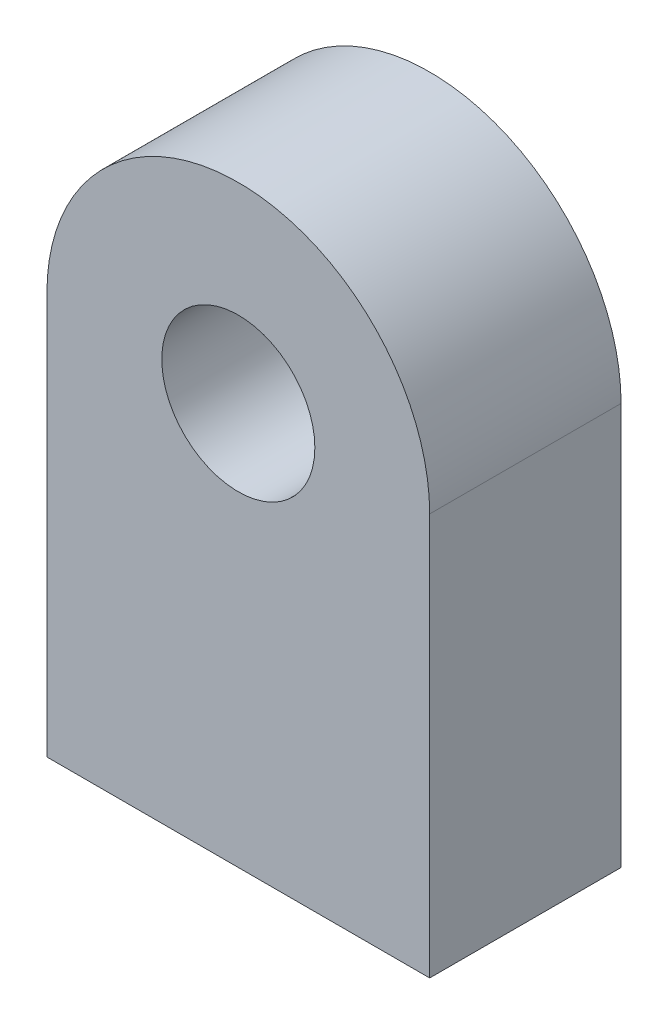
ISO-10303-21;
HEADER;
FILE_DESCRIPTION(('STEP AP214'),'2;1');
FILE_NAME('part.step','',(''),(''),'','','');
FILE_SCHEMA(('AUTOMOTIVE_DESIGN { 1 0 10303 214 1 1 1 1 }'));
ENDSEC;
DATA;
#1=APPLICATION_CONTEXT('core data for automotive mechanical design processes');
#2=APPLICATION_PROTOCOL_DEFINITION('international standard','automotive_design',2000,#1);
#3=PRODUCT_CONTEXT('',#1,'mechanical');
#4=PRODUCT('Part','Part','',(#3));
#5=PRODUCT_RELATED_PRODUCT_CATEGORY('part','',(#4));
#6=PRODUCT_DEFINITION_FORMATION('','',#4);
#7=PRODUCT_DEFINITION_CONTEXT('part definition',#1,'design');
#8=PRODUCT_DEFINITION('design','',#6,#7);
#9=PRODUCT_DEFINITION_SHAPE('','',#8);
#10=(LENGTH_UNIT() NAMED_UNIT(*) SI_UNIT(.MILLI.,.METRE.));
#11=(NAMED_UNIT(*) PLANE_ANGLE_UNIT() SI_UNIT($,.RADIAN.));
#12=(NAMED_UNIT(*) SI_UNIT($,.STERADIAN.) SOLID_ANGLE_UNIT());
#13=UNCERTAINTY_MEASURE_WITH_UNIT(LENGTH_MEASURE(1.E-05),#10,'distance_accuracy_value','');
#14=(GEOMETRIC_REPRESENTATION_CONTEXT(3) GLOBAL_UNCERTAINTY_ASSIGNED_CONTEXT((#13)) GLOBAL_UNIT_ASSIGNED_CONTEXT((#10,
#11,#12)) REPRESENTATION_CONTEXT('',''));
#15=CARTESIAN_POINT('',(0.,0.,0.));
#16=DIRECTION('',(0.,0.,1.));
#17=DIRECTION('',(1.,0.,0.));
#18=AXIS2_PLACEMENT_3D('',#15,#16,#17);
#19=CARTESIAN_POINT('',(0.,21.,10.));
#20=DIRECTION('',(0.,0.,-1.));
#21=DIRECTION('',(-1.,0.,0.));
#22=AXIS2_PLACEMENT_3D('',#19,#20,#21);
#23=CYLINDRICAL_SURFACE('',#22,10.);
#24=CARTESIAN_POINT('',(0.,21.,0.));
#25=DIRECTION('',(0.,0.,1.));
#26=DIRECTION('',(1.,0.,0.));
#27=AXIS2_PLACEMENT_3D('',#24,#25,#26);
#28=CIRCLE('',#27,10.);
#29=CARTESIAN_POINT('',(10.,21.,0.));
#30=VERTEX_POINT('',#29);
#31=CARTESIAN_POINT('',(-10.,21.,0.));
#32=VERTEX_POINT('',#31);
#33=EDGE_CURVE('E110',#30,#32,#28,.T.);
#34=ORIENTED_EDGE('',*,*,#33,.T.);
#35=DIRECTION('',(0.,0.,-1.));
#36=VECTOR('',#35,1.);
#37=CARTESIAN_POINT('',(-10.,21.,10.));
#38=LINE('',#37,#36);
#39=CARTESIAN_POINT('',(-10.,21.,10.));
#40=VERTEX_POINT('',#39);
#41=EDGE_CURVE('E13',#40,#32,#38,.T.);
#42=ORIENTED_EDGE('',*,*,#41,.F.);
#43=CARTESIAN_POINT('',(0.,21.,10.));
#44=DIRECTION('',(0.,0.,1.));
#45=DIRECTION('',(1.,0.,0.));
#46=AXIS2_PLACEMENT_3D('',#43,#44,#45);
#47=CIRCLE('',#46,10.);
#48=CARTESIAN_POINT('',(10.,21.,10.));
#49=VERTEX_POINT('',#48);
#50=EDGE_CURVE('E93',#49,#40,#47,.T.);
#51=ORIENTED_EDGE('',*,*,#50,.F.);
#52=DIRECTION('',(0.,0.,-1.));
#53=VECTOR('',#52,1.);
#54=CARTESIAN_POINT('',(10.,21.,10.));
#55=LINE('',#54,#53);
#56=EDGE_CURVE('E60',#49,#30,#55,.T.);
#57=ORIENTED_EDGE('',*,*,#56,.T.);
#58=EDGE_LOOP('',(#34,#42,#51,#57));
#59=FACE_BOUND('',#58,.T.);
#60=ADVANCED_FACE('F43',(#59),#23,.T.);
#61=CARTESIAN_POINT('',(-10.,0.,10.));
#62=DIRECTION('',(1.,0.,0.));
#63=DIRECTION('',(0.,0.,-1.));
#64=AXIS2_PLACEMENT_3D('',#61,#62,#63);
#65=PLANE('',#64);
#66=DIRECTION('',(0.,-1.,0.));
#67=VECTOR('',#66,1.);
#68=CARTESIAN_POINT('',(-10.,0.,0.));
#69=LINE('',#68,#67);
#70=CARTESIAN_POINT('',(-10.,0.,0.));
#71=VERTEX_POINT('',#70);
#72=EDGE_CURVE('E98',#32,#71,#69,.T.);
#73=ORIENTED_EDGE('',*,*,#72,.T.);
#74=DIRECTION('',(0.,0.,-1.));
#75=VECTOR('',#74,1.);
#76=CARTESIAN_POINT('',(-10.,0.,10.));
#77=LINE('',#76,#75);
#78=CARTESIAN_POINT('',(-10.,0.,10.));
#79=VERTEX_POINT('',#78);
#80=EDGE_CURVE('E52',#79,#71,#77,.T.);
#81=ORIENTED_EDGE('',*,*,#80,.F.);
#82=DIRECTION('',(0.,-1.,0.));
#83=VECTOR('',#82,1.);
#84=CARTESIAN_POINT('',(-10.,0.,10.));
#85=LINE('',#84,#83);
#86=EDGE_CURVE('E86',#40,#79,#85,.T.);
#87=ORIENTED_EDGE('',*,*,#86,.F.);
#88=ORIENTED_EDGE('',*,*,#41,.T.);
#89=EDGE_LOOP('',(#73,#81,#87,#88));
#90=FACE_BOUND('',#89,.T.);
#91=ADVANCED_FACE('F97',(#90),#65,.F.);
#92=CARTESIAN_POINT('',(0.,0.,10.));
#93=DIRECTION('',(0.,1.,0.));
#94=DIRECTION('',(-1.,0.,0.));
#95=AXIS2_PLACEMENT_3D('',#92,#93,#94);
#96=PLANE('',#95);
#97=DIRECTION('',(1.,0.,0.));
#98=VECTOR('',#97,1.);
#99=CARTESIAN_POINT('',(0.,0.,0.));
#100=LINE('',#99,#98);
#101=CARTESIAN_POINT('',(10.,0.,0.));
#102=VERTEX_POINT('',#101);
#103=EDGE_CURVE('E113',#71,#102,#100,.T.);
#104=ORIENTED_EDGE('',*,*,#103,.T.);
#105=DIRECTION('',(0.,0.,-1.));
#106=VECTOR('',#105,1.);
#107=CARTESIAN_POINT('',(10.,0.,10.));
#108=LINE('',#107,#106);
#109=CARTESIAN_POINT('',(10.,0.,10.));
#110=VERTEX_POINT('',#109);
#111=EDGE_CURVE('E75',#110,#102,#108,.T.);
#112=ORIENTED_EDGE('',*,*,#111,.F.);
#113=DIRECTION('',(1.,0.,0.));
#114=VECTOR('',#113,1.);
#115=CARTESIAN_POINT('',(0.,0.,10.));
#116=LINE('',#115,#114);
#117=EDGE_CURVE('E92',#79,#110,#116,.T.);
#118=ORIENTED_EDGE('',*,*,#117,.F.);
#119=ORIENTED_EDGE('',*,*,#80,.T.);
#120=EDGE_LOOP('',(#104,#112,#118,#119));
#121=FACE_BOUND('',#120,.T.);
#122=ADVANCED_FACE('F101',(#121),#96,.F.);
#123=CARTESIAN_POINT('',(0.,21.,10.));
#124=DIRECTION('',(0.,0.,-1.));
#125=DIRECTION('',(-1.,0.,0.));
#126=AXIS2_PLACEMENT_3D('',#123,#124,#125);
#127=CYLINDRICAL_SURFACE('',#126,4.);
#128=CARTESIAN_POINT('',(0.,21.,10.));
#129=DIRECTION('',(0.,0.,1.));
#130=DIRECTION('',(1.,0.,0.));
#131=AXIS2_PLACEMENT_3D('',#128,#129,#130);
#132=CIRCLE('',#131,4.);
#133=CARTESIAN_POINT('',(4.,21.,10.));
#134=VERTEX_POINT('',#133);
#135=EDGE_CURVE('E118',#134,#134,#132,.T.);
#136=ORIENTED_EDGE('',*,*,#135,.T.);
#137=EDGE_LOOP('',(#136));
#138=FACE_BOUND('',#137,.T.);
#139=CARTESIAN_POINT('',(0.,21.,0.));
#140=DIRECTION('',(0.,0.,1.));
#141=DIRECTION('',(1.,0.,0.));
#142=AXIS2_PLACEMENT_3D('',#139,#140,#141);
#143=CIRCLE('',#142,4.);
#144=CARTESIAN_POINT('',(4.,21.,0.));
#145=VERTEX_POINT('',#144);
#146=EDGE_CURVE('E107',#145,#145,#143,.T.);
#147=ORIENTED_EDGE('',*,*,#146,.F.);
#148=EDGE_LOOP('',(#147));
#149=FACE_BOUND('',#148,.T.);
#150=ADVANCED_FACE('F45',(#138,#149),#127,.F.);
#151=CARTESIAN_POINT('',(10.,0.,10.));
#152=DIRECTION('',(1.,0.,0.));
#153=DIRECTION('',(0.,1.,0.));
#154=AXIS2_PLACEMENT_3D('',#151,#152,#153);
#155=PLANE('',#154);
#156=DIRECTION('',(0.,-1.,0.));
#157=VECTOR('',#156,1.);
#158=CARTESIAN_POINT('',(10.,0.,0.));
#159=LINE('',#158,#157);
#160=EDGE_CURVE('E115',#30,#102,#159,.T.);
#161=ORIENTED_EDGE('',*,*,#160,.F.);
#162=ORIENTED_EDGE('',*,*,#56,.F.);
#163=DIRECTION('',(0.,-1.,0.));
#164=VECTOR('',#163,1.);
#165=CARTESIAN_POINT('',(10.,0.,10.));
#166=LINE('',#165,#164);
#167=EDGE_CURVE('E102',#49,#110,#166,.T.);
#168=ORIENTED_EDGE('',*,*,#167,.T.);
#169=ORIENTED_EDGE('',*,*,#111,.T.);
#170=EDGE_LOOP('',(#161,#162,#168,#169));
#171=FACE_BOUND('',#170,.T.);
#172=ADVANCED_FACE('F129',(#171),#155,.T.);
#173=CARTESIAN_POINT('',(0.,0.,10.));
#174=DIRECTION('',(0.,0.,1.));
#175=DIRECTION('',(1.,0.,0.));
#176=AXIS2_PLACEMENT_3D('',#173,#174,#175);
#177=PLANE('',#176);
#178=ORIENTED_EDGE('',*,*,#135,.F.);
#179=EDGE_LOOP('',(#178));
#180=FACE_BOUND('',#179,.T.);
#181=ORIENTED_EDGE('',*,*,#50,.T.);
#182=ORIENTED_EDGE('',*,*,#86,.T.);
#183=ORIENTED_EDGE('',*,*,#117,.T.);
#184=ORIENTED_EDGE('',*,*,#167,.F.);
#185=EDGE_LOOP('',(#181,#182,#183,#184));
#186=FACE_BOUND('',#185,.T.);
#187=ADVANCED_FACE('F89',(#180,#186),#177,.T.);
#188=CARTESIAN_POINT('',(0.,0.,0.));
#189=DIRECTION('',(0.,0.,1.));
#190=DIRECTION('',(1.,0.,0.));
#191=AXIS2_PLACEMENT_3D('',#188,#189,#190);
#192=PLANE('',#191);
#193=ORIENTED_EDGE('',*,*,#146,.T.);
#194=EDGE_LOOP('',(#193));
#195=FACE_BOUND('',#194,.T.);
#196=ORIENTED_EDGE('',*,*,#33,.F.);
#197=ORIENTED_EDGE('',*,*,#160,.T.);
#198=ORIENTED_EDGE('',*,*,#103,.F.);
#199=ORIENTED_EDGE('',*,*,#72,.F.);
#200=EDGE_LOOP('',(#196,#197,#198,#199));
#201=FACE_BOUND('',#200,.T.);
#202=ADVANCED_FACE('F128',(#195,#201),#192,.F.);
#203=CLOSED_SHELL('',(#60,#91,#122,#150,#172,#187,#202));
#204=MANIFOLD_SOLID_BREP('B2',#203);
#205=ADVANCED_BREP_SHAPE_REPRESENTATION('',(#18,#204),#14);
#206=SHAPE_DEFINITION_REPRESENTATION(#9,#205);
ENDSEC;
END-ISO-10303-21;
